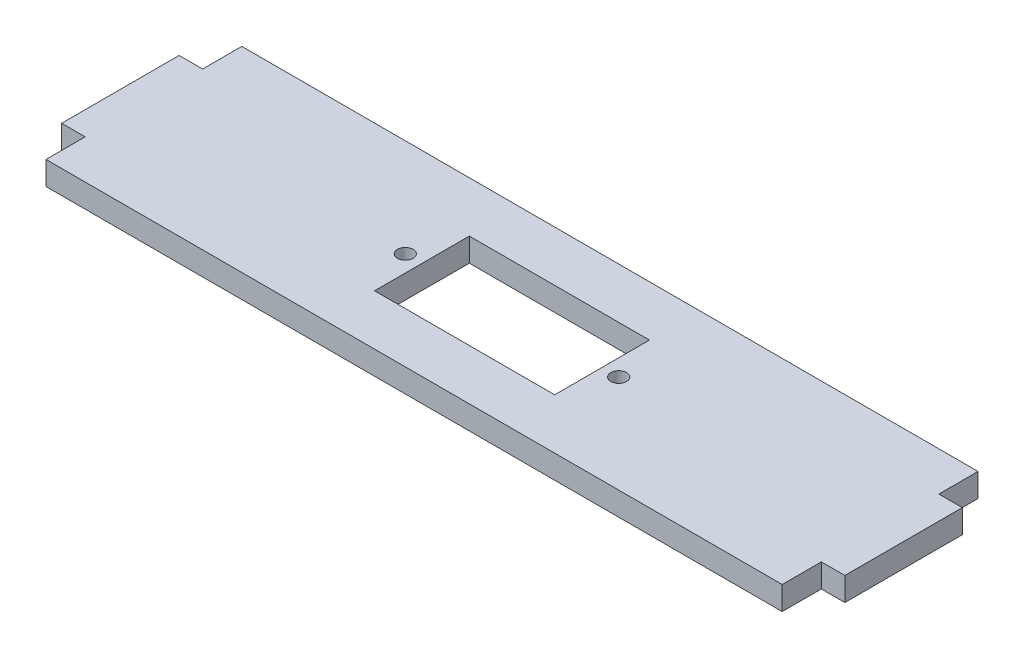
ISO-10303-21;
HEADER;
FILE_DESCRIPTION(('STEP AP214'),'2;1');
FILE_NAME('part.step','',(''),(''),'','','');
FILE_SCHEMA(('AUTOMOTIVE_DESIGN { 1 0 10303 214 1 1 1 1 }'));
ENDSEC;
DATA;
#1=APPLICATION_CONTEXT('core data for automotive mechanical design processes');
#2=APPLICATION_PROTOCOL_DEFINITION('international standard','automotive_design',2000,#1);
#3=PRODUCT_CONTEXT('',#1,'mechanical');
#4=PRODUCT('Part','Part','',(#3));
#5=PRODUCT_RELATED_PRODUCT_CATEGORY('part','',(#4));
#6=PRODUCT_DEFINITION_FORMATION('','',#4);
#7=PRODUCT_DEFINITION_CONTEXT('part definition',#1,'design');
#8=PRODUCT_DEFINITION('design','',#6,#7);
#9=PRODUCT_DEFINITION_SHAPE('','',#8);
#10=(LENGTH_UNIT() NAMED_UNIT(*) SI_UNIT(.MILLI.,.METRE.));
#11=(NAMED_UNIT(*) PLANE_ANGLE_UNIT() SI_UNIT($,.RADIAN.));
#12=(NAMED_UNIT(*) SI_UNIT($,.STERADIAN.) SOLID_ANGLE_UNIT());
#13=UNCERTAINTY_MEASURE_WITH_UNIT(LENGTH_MEASURE(1.E-05),#10,'distance_accuracy_value','');
#14=(GEOMETRIC_REPRESENTATION_CONTEXT(3) GLOBAL_UNCERTAINTY_ASSIGNED_CONTEXT((#13)) GLOBAL_UNIT_ASSIGNED_CONTEXT((#10,
#11,#12)) REPRESENTATION_CONTEXT('',''));
#15=CARTESIAN_POINT('',(0.,0.,0.));
#16=DIRECTION('',(0.,0.,1.));
#17=DIRECTION('',(1.,0.,0.));
#18=AXIS2_PLACEMENT_3D('',#15,#16,#17);
#19=CARTESIAN_POINT('',(-47.,3.,0.));
#20=DIRECTION('',(-1.,0.,0.));
#21=DIRECTION('',(0.,0.,1.));
#22=AXIS2_PLACEMENT_3D('',#19,#20,#21);
#23=PLANE('',#22);
#24=DIRECTION('',(0.,0.,-1.));
#25=VECTOR('',#24,1.);
#26=CARTESIAN_POINT('',(-47.,0.,0.));
#27=LINE('',#26,#25);
#28=CARTESIAN_POINT('',(-47.,0.,12.5));
#29=VERTEX_POINT('',#28);
#30=CARTESIAN_POINT('',(-47.,0.,7.5));
#31=VERTEX_POINT('',#30);
#32=EDGE_CURVE('E236',#29,#31,#27,.T.);
#33=ORIENTED_EDGE('',*,*,#32,.F.);
#34=DIRECTION('',(0.,-1.,0.));
#35=VECTOR('',#34,1.);
#36=CARTESIAN_POINT('',(-47.,3.,12.5));
#37=LINE('',#36,#35);
#38=CARTESIAN_POINT('',(-47.,3.,12.5));
#39=VERTEX_POINT('',#38);
#40=EDGE_CURVE('E315',#39,#29,#37,.T.);
#41=ORIENTED_EDGE('',*,*,#40,.F.);
#42=DIRECTION('',(0.,0.,-1.));
#43=VECTOR('',#42,1.);
#44=CARTESIAN_POINT('',(-47.,3.,0.));
#45=LINE('',#44,#43);
#46=CARTESIAN_POINT('',(-47.,3.,7.5));
#47=VERTEX_POINT('',#46);
#48=EDGE_CURVE('E192',#39,#47,#45,.T.);
#49=ORIENTED_EDGE('',*,*,#48,.T.);
#50=DIRECTION('',(0.,-1.,0.));
#51=VECTOR('',#50,1.);
#52=CARTESIAN_POINT('',(-47.,3.,7.5));
#53=LINE('',#52,#51);
#54=EDGE_CURVE('E235',#47,#31,#53,.T.);
#55=ORIENTED_EDGE('',*,*,#54,.T.);
#56=EDGE_LOOP('',(#33,#41,#49,#55));
#57=FACE_BOUND('',#56,.T.);
#58=ADVANCED_FACE('F41',(#57),#23,.T.);
#59=CARTESIAN_POINT('',(0.,3.,12.5));
#60=DIRECTION('',(0.,0.,-1.));
#61=DIRECTION('',(-1.,0.,0.));
#62=AXIS2_PLACEMENT_3D('',#59,#60,#61);
#63=PLANE('',#62);
#64=DIRECTION('',(1.,0.,0.));
#65=VECTOR('',#64,1.);
#66=CARTESIAN_POINT('',(0.,0.,12.5));
#67=LINE('',#66,#65);
#68=CARTESIAN_POINT('',(47.,0.,12.5));
#69=VERTEX_POINT('',#68);
#70=EDGE_CURVE('E240',#29,#69,#67,.T.);
#71=ORIENTED_EDGE('',*,*,#70,.T.);
#72=DIRECTION('',(0.,-1.,0.));
#73=VECTOR('',#72,1.);
#74=CARTESIAN_POINT('',(47.,3.,12.5));
#75=LINE('',#74,#73);
#76=CARTESIAN_POINT('',(47.,3.,12.5));
#77=VERTEX_POINT('',#76);
#78=EDGE_CURVE('E311',#77,#69,#75,.T.);
#79=ORIENTED_EDGE('',*,*,#78,.F.);
#80=DIRECTION('',(1.,0.,0.));
#81=VECTOR('',#80,1.);
#82=CARTESIAN_POINT('',(0.,3.,12.5));
#83=LINE('',#82,#81);
#84=EDGE_CURVE('E196',#39,#77,#83,.T.);
#85=ORIENTED_EDGE('',*,*,#84,.F.);
#86=ORIENTED_EDGE('',*,*,#40,.T.);
#87=EDGE_LOOP('',(#71,#79,#85,#86));
#88=FACE_BOUND('',#87,.T.);
#89=ADVANCED_FACE('F364',(#88),#63,.F.);
#90=CARTESIAN_POINT('',(47.,3.,0.));
#91=DIRECTION('',(-1.,0.,0.));
#92=DIRECTION('',(0.,0.,1.));
#93=AXIS2_PLACEMENT_3D('',#90,#91,#92);
#94=PLANE('',#93);
#95=DIRECTION('',(0.,0.,-1.));
#96=VECTOR('',#95,1.);
#97=CARTESIAN_POINT('',(47.,0.,0.));
#98=LINE('',#97,#96);
#99=CARTESIAN_POINT('',(47.,0.,7.5));
#100=VERTEX_POINT('',#99);
#101=EDGE_CURVE('E243',#69,#100,#98,.T.);
#102=ORIENTED_EDGE('',*,*,#101,.T.);
#103=DIRECTION('',(0.,-1.,0.));
#104=VECTOR('',#103,1.);
#105=CARTESIAN_POINT('',(47.,3.,7.5));
#106=LINE('',#105,#104);
#107=CARTESIAN_POINT('',(47.,3.,7.5));
#108=VERTEX_POINT('',#107);
#109=EDGE_CURVE('E308',#108,#100,#106,.T.);
#110=ORIENTED_EDGE('',*,*,#109,.F.);
#111=DIRECTION('',(0.,0.,-1.));
#112=VECTOR('',#111,1.);
#113=CARTESIAN_POINT('',(47.,3.,0.));
#114=LINE('',#113,#112);
#115=EDGE_CURVE('E200',#77,#108,#114,.T.);
#116=ORIENTED_EDGE('',*,*,#115,.F.);
#117=ORIENTED_EDGE('',*,*,#78,.T.);
#118=EDGE_LOOP('',(#102,#110,#116,#117));
#119=FACE_BOUND('',#118,.T.);
#120=ADVANCED_FACE('F369',(#119),#94,.F.);
#121=CARTESIAN_POINT('',(0.,3.,7.5));
#122=DIRECTION('',(0.,0.,1.));
#123=DIRECTION('',(1.,0.,0.));
#124=AXIS2_PLACEMENT_3D('',#121,#122,#123);
#125=PLANE('',#124);
#126=DIRECTION('',(-1.,0.,0.));
#127=VECTOR('',#126,1.);
#128=CARTESIAN_POINT('',(0.,0.,7.5));
#129=LINE('',#128,#127);
#130=CARTESIAN_POINT('',(50.,0.,7.5));
#131=VERTEX_POINT('',#130);
#132=EDGE_CURVE('E247',#131,#100,#129,.T.);
#133=ORIENTED_EDGE('',*,*,#132,.F.);
#134=DIRECTION('',(0.,-1.,0.));
#135=VECTOR('',#134,1.);
#136=CARTESIAN_POINT('',(50.,3.,7.5));
#137=LINE('',#136,#135);
#138=CARTESIAN_POINT('',(50.,3.,7.5));
#139=VERTEX_POINT('',#138);
#140=EDGE_CURVE('E305',#139,#131,#137,.T.);
#141=ORIENTED_EDGE('',*,*,#140,.F.);
#142=DIRECTION('',(-1.,0.,0.));
#143=VECTOR('',#142,1.);
#144=CARTESIAN_POINT('',(0.,3.,7.5));
#145=LINE('',#144,#143);
#146=EDGE_CURVE('E203',#139,#108,#145,.T.);
#147=ORIENTED_EDGE('',*,*,#146,.T.);
#148=ORIENTED_EDGE('',*,*,#109,.T.);
#149=EDGE_LOOP('',(#133,#141,#147,#148));
#150=FACE_BOUND('',#149,.T.);
#151=ADVANCED_FACE('F416',(#150),#125,.T.);
#152=CARTESIAN_POINT('',(50.,3.,0.));
#153=DIRECTION('',(1.,0.,0.));
#154=DIRECTION('',(0.,0.,-1.));
#155=AXIS2_PLACEMENT_3D('',#152,#153,#154);
#156=PLANE('',#155);
#157=DIRECTION('',(0.,0.,1.));
#158=VECTOR('',#157,1.);
#159=CARTESIAN_POINT('',(50.,0.,0.));
#160=LINE('',#159,#158);
#161=CARTESIAN_POINT('',(50.,0.,-7.5));
#162=VERTEX_POINT('',#161);
#163=EDGE_CURVE('E251',#162,#131,#160,.T.);
#164=ORIENTED_EDGE('',*,*,#163,.F.);
#165=DIRECTION('',(0.,-1.,0.));
#166=VECTOR('',#165,1.);
#167=CARTESIAN_POINT('',(50.,3.,-7.5));
#168=LINE('',#167,#166);
#169=CARTESIAN_POINT('',(50.,3.,-7.5));
#170=VERTEX_POINT('',#169);
#171=EDGE_CURVE('E302',#170,#162,#168,.T.);
#172=ORIENTED_EDGE('',*,*,#171,.F.);
#173=DIRECTION('',(0.,0.,1.));
#174=VECTOR('',#173,1.);
#175=CARTESIAN_POINT('',(50.,3.,0.));
#176=LINE('',#175,#174);
#177=EDGE_CURVE('E207',#170,#139,#176,.T.);
#178=ORIENTED_EDGE('',*,*,#177,.T.);
#179=ORIENTED_EDGE('',*,*,#140,.T.);
#180=EDGE_LOOP('',(#164,#172,#178,#179));
#181=FACE_BOUND('',#180,.T.);
#182=ADVANCED_FACE('F412',(#181),#156,.T.);
#183=CARTESIAN_POINT('',(0.,3.,-7.5));
#184=DIRECTION('',(0.,0.,1.));
#185=DIRECTION('',(1.,0.,0.));
#186=AXIS2_PLACEMENT_3D('',#183,#184,#185);
#187=PLANE('',#186);
#188=DIRECTION('',(-1.,0.,0.));
#189=VECTOR('',#188,1.);
#190=CARTESIAN_POINT('',(0.,0.,-7.5));
#191=LINE('',#190,#189);
#192=CARTESIAN_POINT('',(47.,0.,-7.5));
#193=VERTEX_POINT('',#192);
#194=EDGE_CURVE('E255',#162,#193,#191,.T.);
#195=ORIENTED_EDGE('',*,*,#194,.T.);
#196=DIRECTION('',(0.,-1.,0.));
#197=VECTOR('',#196,1.);
#198=CARTESIAN_POINT('',(47.,3.,-7.5));
#199=LINE('',#198,#197);
#200=CARTESIAN_POINT('',(47.,3.,-7.5));
#201=VERTEX_POINT('',#200);
#202=EDGE_CURVE('E299',#201,#193,#199,.T.);
#203=ORIENTED_EDGE('',*,*,#202,.F.);
#204=DIRECTION('',(-1.,0.,0.));
#205=VECTOR('',#204,1.);
#206=CARTESIAN_POINT('',(0.,3.,-7.5));
#207=LINE('',#206,#205);
#208=EDGE_CURVE('E211',#170,#201,#207,.T.);
#209=ORIENTED_EDGE('',*,*,#208,.F.);
#210=ORIENTED_EDGE('',*,*,#171,.T.);
#211=EDGE_LOOP('',(#195,#203,#209,#210));
#212=FACE_BOUND('',#211,.T.);
#213=ADVANCED_FACE('F423',(#212),#187,.F.);
#214=CARTESIAN_POINT('',(47.,3.,0.));
#215=DIRECTION('',(1.,0.,0.));
#216=DIRECTION('',(0.,0.,-1.));
#217=AXIS2_PLACEMENT_3D('',#214,#215,#216);
#218=PLANE('',#217);
#219=DIRECTION('',(0.,0.,1.));
#220=VECTOR('',#219,1.);
#221=CARTESIAN_POINT('',(47.,0.,0.));
#222=LINE('',#221,#220);
#223=CARTESIAN_POINT('',(47.,0.,-12.5));
#224=VERTEX_POINT('',#223);
#225=EDGE_CURVE('E259',#224,#193,#222,.T.);
#226=ORIENTED_EDGE('',*,*,#225,.F.);
#227=DIRECTION('',(0.,-1.,0.));
#228=VECTOR('',#227,1.);
#229=CARTESIAN_POINT('',(47.,3.,-12.5));
#230=LINE('',#229,#228);
#231=CARTESIAN_POINT('',(47.,3.,-12.5));
#232=VERTEX_POINT('',#231);
#233=EDGE_CURVE('E296',#232,#224,#230,.T.);
#234=ORIENTED_EDGE('',*,*,#233,.F.);
#235=DIRECTION('',(0.,0.,1.));
#236=VECTOR('',#235,1.);
#237=CARTESIAN_POINT('',(47.,3.,0.));
#238=LINE('',#237,#236);
#239=EDGE_CURVE('E214',#232,#201,#238,.T.);
#240=ORIENTED_EDGE('',*,*,#239,.T.);
#241=ORIENTED_EDGE('',*,*,#202,.T.);
#242=EDGE_LOOP('',(#226,#234,#240,#241));
#243=FACE_BOUND('',#242,.T.);
#244=ADVANCED_FACE('F406',(#243),#218,.T.);
#245=CARTESIAN_POINT('',(0.,3.,-12.5));
#246=DIRECTION('',(0.,0.,-1.));
#247=DIRECTION('',(-1.,0.,0.));
#248=AXIS2_PLACEMENT_3D('',#245,#246,#247);
#249=PLANE('',#248);
#250=DIRECTION('',(1.,0.,0.));
#251=VECTOR('',#250,1.);
#252=CARTESIAN_POINT('',(0.,0.,-12.5));
#253=LINE('',#252,#251);
#254=CARTESIAN_POINT('',(-47.,0.,-12.5));
#255=VERTEX_POINT('',#254);
#256=EDGE_CURVE('E263',#255,#224,#253,.T.);
#257=ORIENTED_EDGE('',*,*,#256,.F.);
#258=DIRECTION('',(0.,-1.,0.));
#259=VECTOR('',#258,1.);
#260=CARTESIAN_POINT('',(-47.,3.,-12.5));
#261=LINE('',#260,#259);
#262=CARTESIAN_POINT('',(-47.,3.,-12.5));
#263=VERTEX_POINT('',#262);
#264=EDGE_CURVE('E293',#263,#255,#261,.T.);
#265=ORIENTED_EDGE('',*,*,#264,.F.);
#266=DIRECTION('',(1.,0.,0.));
#267=VECTOR('',#266,1.);
#268=CARTESIAN_POINT('',(0.,3.,-12.5));
#269=LINE('',#268,#267);
#270=EDGE_CURVE('E218',#263,#232,#269,.T.);
#271=ORIENTED_EDGE('',*,*,#270,.T.);
#272=ORIENTED_EDGE('',*,*,#233,.T.);
#273=EDGE_LOOP('',(#257,#265,#271,#272));
#274=FACE_BOUND('',#273,.T.);
#275=ADVANCED_FACE('F401',(#274),#249,.T.);
#276=CARTESIAN_POINT('',(-47.,3.,0.));
#277=DIRECTION('',(1.,0.,0.));
#278=DIRECTION('',(0.,0.,-1.));
#279=AXIS2_PLACEMENT_3D('',#276,#277,#278);
#280=PLANE('',#279);
#281=DIRECTION('',(0.,0.,1.));
#282=VECTOR('',#281,1.);
#283=CARTESIAN_POINT('',(-47.,0.,0.));
#284=LINE('',#283,#282);
#285=CARTESIAN_POINT('',(-47.,0.,-7.5));
#286=VERTEX_POINT('',#285);
#287=EDGE_CURVE('E267',#255,#286,#284,.T.);
#288=ORIENTED_EDGE('',*,*,#287,.T.);
#289=DIRECTION('',(0.,-1.,0.));
#290=VECTOR('',#289,1.);
#291=CARTESIAN_POINT('',(-47.,3.,-7.5));
#292=LINE('',#291,#290);
#293=CARTESIAN_POINT('',(-47.,3.,-7.5));
#294=VERTEX_POINT('',#293);
#295=EDGE_CURVE('E290',#294,#286,#292,.T.);
#296=ORIENTED_EDGE('',*,*,#295,.F.);
#297=DIRECTION('',(0.,0.,1.));
#298=VECTOR('',#297,1.);
#299=CARTESIAN_POINT('',(-47.,3.,0.));
#300=LINE('',#299,#298);
#301=EDGE_CURVE('E222',#263,#294,#300,.T.);
#302=ORIENTED_EDGE('',*,*,#301,.F.);
#303=ORIENTED_EDGE('',*,*,#264,.T.);
#304=EDGE_LOOP('',(#288,#296,#302,#303));
#305=FACE_BOUND('',#304,.T.);
#306=ADVANCED_FACE('F398',(#305),#280,.F.);
#307=CARTESIAN_POINT('',(0.,3.,-7.5));
#308=DIRECTION('',(0.,0.,-1.));
#309=DIRECTION('',(-1.,0.,0.));
#310=AXIS2_PLACEMENT_3D('',#307,#308,#309);
#311=PLANE('',#310);
#312=DIRECTION('',(1.,0.,0.));
#313=VECTOR('',#312,1.);
#314=CARTESIAN_POINT('',(0.,0.,-7.5));
#315=LINE('',#314,#313);
#316=CARTESIAN_POINT('',(-50.,0.,-7.5));
#317=VERTEX_POINT('',#316);
#318=EDGE_CURVE('E271',#317,#286,#315,.T.);
#319=ORIENTED_EDGE('',*,*,#318,.F.);
#320=DIRECTION('',(0.,-1.,0.));
#321=VECTOR('',#320,1.);
#322=CARTESIAN_POINT('',(-50.,3.,-7.5));
#323=LINE('',#322,#321);
#324=CARTESIAN_POINT('',(-50.,3.,-7.5));
#325=VERTEX_POINT('',#324);
#326=EDGE_CURVE('E287',#325,#317,#323,.T.);
#327=ORIENTED_EDGE('',*,*,#326,.F.);
#328=DIRECTION('',(1.,0.,0.));
#329=VECTOR('',#328,1.);
#330=CARTESIAN_POINT('',(0.,3.,-7.5));
#331=LINE('',#330,#329);
#332=EDGE_CURVE('E225',#325,#294,#331,.T.);
#333=ORIENTED_EDGE('',*,*,#332,.T.);
#334=ORIENTED_EDGE('',*,*,#295,.T.);
#335=EDGE_LOOP('',(#319,#327,#333,#334));
#336=FACE_BOUND('',#335,.T.);
#337=ADVANCED_FACE('F394',(#336),#311,.T.);
#338=CARTESIAN_POINT('',(-50.,3.,0.));
#339=DIRECTION('',(1.,0.,0.));
#340=DIRECTION('',(0.,0.,-1.));
#341=AXIS2_PLACEMENT_3D('',#338,#339,#340);
#342=PLANE('',#341);
#343=DIRECTION('',(0.,0.,1.));
#344=VECTOR('',#343,1.);
#345=CARTESIAN_POINT('',(-50.,0.,0.));
#346=LINE('',#345,#344);
#347=CARTESIAN_POINT('',(-50.,0.,7.5));
#348=VERTEX_POINT('',#347);
#349=EDGE_CURVE('E275',#317,#348,#346,.T.);
#350=ORIENTED_EDGE('',*,*,#349,.T.);
#351=DIRECTION('',(0.,-1.,0.));
#352=VECTOR('',#351,1.);
#353=CARTESIAN_POINT('',(-50.,3.,7.5));
#354=LINE('',#353,#352);
#355=CARTESIAN_POINT('',(-50.,3.,7.5));
#356=VERTEX_POINT('',#355);
#357=EDGE_CURVE('E283',#356,#348,#354,.T.);
#358=ORIENTED_EDGE('',*,*,#357,.F.);
#359=DIRECTION('',(0.,0.,1.));
#360=VECTOR('',#359,1.);
#361=CARTESIAN_POINT('',(-50.,3.,0.));
#362=LINE('',#361,#360);
#363=EDGE_CURVE('E229',#325,#356,#362,.T.);
#364=ORIENTED_EDGE('',*,*,#363,.F.);
#365=ORIENTED_EDGE('',*,*,#326,.T.);
#366=EDGE_LOOP('',(#350,#358,#364,#365));
#367=FACE_BOUND('',#366,.T.);
#368=ADVANCED_FACE('F359',(#367),#342,.F.);
#369=CARTESIAN_POINT('',(0.,3.,7.5));
#370=DIRECTION('',(0.,0.,-1.));
#371=DIRECTION('',(-1.,0.,0.));
#372=AXIS2_PLACEMENT_3D('',#369,#370,#371);
#373=PLANE('',#372);
#374=DIRECTION('',(1.,0.,0.));
#375=VECTOR('',#374,1.);
#376=CARTESIAN_POINT('',(0.,0.,7.5));
#377=LINE('',#376,#375);
#378=EDGE_CURVE('E197',#348,#31,#377,.T.);
#379=ORIENTED_EDGE('',*,*,#378,.T.);
#380=ORIENTED_EDGE('',*,*,#54,.F.);
#381=DIRECTION('',(1.,0.,0.));
#382=VECTOR('',#381,1.);
#383=CARTESIAN_POINT('',(0.,3.,7.5));
#384=LINE('',#383,#382);
#385=EDGE_CURVE('E232',#356,#47,#384,.T.);
#386=ORIENTED_EDGE('',*,*,#385,.F.);
#387=ORIENTED_EDGE('',*,*,#357,.T.);
#388=EDGE_LOOP('',(#379,#380,#386,#387));
#389=FACE_BOUND('',#388,.T.);
#390=ADVANCED_FACE('F349',(#389),#373,.F.);
#391=CARTESIAN_POINT('',(0.,3.,0.));
#392=DIRECTION('',(0.,1.,0.));
#393=DIRECTION('',(0.,0.,1.));
#394=AXIS2_PLACEMENT_3D('',#391,#392,#393);
#395=PLANE('',#394);
#396=CARTESIAN_POINT('',(-13.625,3.,0.));
#397=DIRECTION('',(0.,1.,0.));
#398=DIRECTION('',(0.,0.,1.));
#399=AXIS2_PLACEMENT_3D('',#396,#397,#398);
#400=CIRCLE('',#399,1.);
#401=CARTESIAN_POINT('',(-13.625,3.,1.));
#402=VERTEX_POINT('',#401);
#403=EDGE_CURVE('E328',#402,#402,#400,.T.);
#404=ORIENTED_EDGE('',*,*,#403,.F.);
#405=EDGE_LOOP('',(#404));
#406=FACE_BOUND('',#405,.T.);
#407=CARTESIAN_POINT('',(13.625,3.,0.));
#408=DIRECTION('',(0.,1.,0.));
#409=DIRECTION('',(0.,0.,1.));
#410=AXIS2_PLACEMENT_3D('',#407,#408,#409);
#411=CIRCLE('',#410,1.00000000000001);
#412=CARTESIAN_POINT('',(13.625,3.,1.00000000000001));
#413=VERTEX_POINT('',#412);
#414=EDGE_CURVE('E187',#413,#413,#411,.T.);
#415=ORIENTED_EDGE('',*,*,#414,.F.);
#416=EDGE_LOOP('',(#415));
#417=FACE_BOUND('',#416,.T.);
#418=DIRECTION('',(0.,0.,1.));
#419=VECTOR('',#418,1.);
#420=CARTESIAN_POINT('',(-11.5,3.,6.05));
#421=LINE('',#420,#419);
#422=CARTESIAN_POINT('',(-11.5,3.,-6.05));
#423=VERTEX_POINT('',#422);
#424=CARTESIAN_POINT('',(-11.5,3.,6.05));
#425=VERTEX_POINT('',#424);
#426=EDGE_CURVE('E58',#423,#425,#421,.T.);
#427=ORIENTED_EDGE('',*,*,#426,.F.);
#428=DIRECTION('',(-1.,0.,0.));
#429=VECTOR('',#428,1.);
#430=CARTESIAN_POINT('',(-11.5,3.,-6.05));
#431=LINE('',#430,#429);
#432=CARTESIAN_POINT('',(11.5,3.,-6.05));
#433=VERTEX_POINT('',#432);
#434=EDGE_CURVE('E177',#433,#423,#431,.T.);
#435=ORIENTED_EDGE('',*,*,#434,.F.);
#436=DIRECTION('',(0.,0.,-1.));
#437=VECTOR('',#436,1.);
#438=CARTESIAN_POINT('',(11.5,3.,6.05));
#439=LINE('',#438,#437);
#440=CARTESIAN_POINT('',(11.5,3.,6.05));
#441=VERTEX_POINT('',#440);
#442=EDGE_CURVE('E159',#441,#433,#439,.T.);
#443=ORIENTED_EDGE('',*,*,#442,.F.);
#444=DIRECTION('',(1.,0.,0.));
#445=VECTOR('',#444,1.);
#446=CARTESIAN_POINT('',(-11.5,3.,6.05));
#447=LINE('',#446,#445);
#448=EDGE_CURVE('E169',#425,#441,#447,.T.);
#449=ORIENTED_EDGE('',*,*,#448,.F.);
#450=EDGE_LOOP('',(#427,#435,#443,#449));
#451=FACE_BOUND('',#450,.T.);
#452=ORIENTED_EDGE('',*,*,#48,.F.);
#453=ORIENTED_EDGE('',*,*,#84,.T.);
#454=ORIENTED_EDGE('',*,*,#115,.T.);
#455=ORIENTED_EDGE('',*,*,#146,.F.);
#456=ORIENTED_EDGE('',*,*,#177,.F.);
#457=ORIENTED_EDGE('',*,*,#208,.T.);
#458=ORIENTED_EDGE('',*,*,#239,.F.);
#459=ORIENTED_EDGE('',*,*,#270,.F.);
#460=ORIENTED_EDGE('',*,*,#301,.T.);
#461=ORIENTED_EDGE('',*,*,#332,.F.);
#462=ORIENTED_EDGE('',*,*,#363,.T.);
#463=ORIENTED_EDGE('',*,*,#385,.T.);
#464=EDGE_LOOP('',(#452,#453,#454,#455,#456,#457,#458,#459,#460,#461,#462,#463));
#465=FACE_BOUND('',#464,.T.);
#466=ADVANCED_FACE('F174',(#406,#417,#451,#465),#395,.T.);
#467=CARTESIAN_POINT('',(0.,0.,0.));
#468=DIRECTION('',(0.,1.,0.));
#469=DIRECTION('',(0.,0.,1.));
#470=AXIS2_PLACEMENT_3D('',#467,#468,#469);
#471=PLANE('',#470);
#472=CARTESIAN_POINT('',(-13.625,0.,0.));
#473=DIRECTION('',(0.,1.,0.));
#474=DIRECTION('',(0.,0.,1.));
#475=AXIS2_PLACEMENT_3D('',#472,#473,#474);
#476=CIRCLE('',#475,1.);
#477=CARTESIAN_POINT('',(-13.625,0.,1.));
#478=VERTEX_POINT('',#477);
#479=EDGE_CURVE('E44',#478,#478,#476,.T.);
#480=ORIENTED_EDGE('',*,*,#479,.T.);
#481=EDGE_LOOP('',(#480));
#482=FACE_BOUND('',#481,.T.);
#483=CARTESIAN_POINT('',(13.625,0.,0.));
#484=DIRECTION('',(0.,1.,0.));
#485=DIRECTION('',(0.,0.,1.));
#486=AXIS2_PLACEMENT_3D('',#483,#484,#485);
#487=CIRCLE('',#486,1.00000000000001);
#488=CARTESIAN_POINT('',(13.625,0.,1.00000000000001));
#489=VERTEX_POINT('',#488);
#490=EDGE_CURVE('E325',#489,#489,#487,.T.);
#491=ORIENTED_EDGE('',*,*,#490,.T.);
#492=EDGE_LOOP('',(#491));
#493=FACE_BOUND('',#492,.T.);
#494=DIRECTION('',(-1.,0.,0.));
#495=VECTOR('',#494,1.);
#496=CARTESIAN_POINT('',(0.,0.,-6.05));
#497=LINE('',#496,#495);
#498=CARTESIAN_POINT('',(11.5,0.,-6.05));
#499=VERTEX_POINT('',#498);
#500=CARTESIAN_POINT('',(-11.5,0.,-6.05));
#501=VERTEX_POINT('',#500);
#502=EDGE_CURVE('E50',#499,#501,#497,.T.);
#503=ORIENTED_EDGE('',*,*,#502,.T.);
#504=DIRECTION('',(0.,0.,1.));
#505=VECTOR('',#504,1.);
#506=CARTESIAN_POINT('',(-11.5,0.,0.));
#507=LINE('',#506,#505);
#508=CARTESIAN_POINT('',(-11.5,0.,6.05));
#509=VERTEX_POINT('',#508);
#510=EDGE_CURVE('E11',#501,#509,#507,.T.);
#511=ORIENTED_EDGE('',*,*,#510,.T.);
#512=DIRECTION('',(1.,0.,0.));
#513=VECTOR('',#512,1.);
#514=CARTESIAN_POINT('',(0.,0.,6.05));
#515=LINE('',#514,#513);
#516=CARTESIAN_POINT('',(11.5,0.,6.05));
#517=VERTEX_POINT('',#516);
#518=EDGE_CURVE('E318',#509,#517,#515,.T.);
#519=ORIENTED_EDGE('',*,*,#518,.T.);
#520=DIRECTION('',(0.,0.,-1.));
#521=VECTOR('',#520,1.);
#522=CARTESIAN_POINT('',(11.5,0.,0.));
#523=LINE('',#522,#521);
#524=EDGE_CURVE('E162',#517,#499,#523,.T.);
#525=ORIENTED_EDGE('',*,*,#524,.T.);
#526=EDGE_LOOP('',(#503,#511,#519,#525));
#527=FACE_BOUND('',#526,.T.);
#528=ORIENTED_EDGE('',*,*,#32,.T.);
#529=ORIENTED_EDGE('',*,*,#378,.F.);
#530=ORIENTED_EDGE('',*,*,#349,.F.);
#531=ORIENTED_EDGE('',*,*,#318,.T.);
#532=ORIENTED_EDGE('',*,*,#287,.F.);
#533=ORIENTED_EDGE('',*,*,#256,.T.);
#534=ORIENTED_EDGE('',*,*,#225,.T.);
#535=ORIENTED_EDGE('',*,*,#194,.F.);
#536=ORIENTED_EDGE('',*,*,#163,.T.);
#537=ORIENTED_EDGE('',*,*,#132,.T.);
#538=ORIENTED_EDGE('',*,*,#101,.F.);
#539=ORIENTED_EDGE('',*,*,#70,.F.);
#540=EDGE_LOOP('',(#528,#529,#530,#531,#532,#533,#534,#535,#536,#537,#538,#539));
#541=FACE_BOUND('',#540,.T.);
#542=ADVANCED_FACE('F348',(#482,#493,#527,#541),#471,.F.);
#543=CARTESIAN_POINT('',(-11.5,-20.3,6.05));
#544=DIRECTION('',(-1.,0.,0.));
#545=DIRECTION('',(0.,0.,1.));
#546=AXIS2_PLACEMENT_3D('',#543,#544,#545);
#547=PLANE('',#546);
#548=DIRECTION('',(0.,1.,0.));
#549=VECTOR('',#548,1.);
#550=CARTESIAN_POINT('',(-11.5,-20.3,-6.05));
#551=LINE('',#550,#549);
#552=EDGE_CURVE('E184',#501,#423,#551,.T.);
#553=ORIENTED_EDGE('',*,*,#552,.T.);
#554=ORIENTED_EDGE('',*,*,#426,.T.);
#555=DIRECTION('',(0.,1.,0.));
#556=VECTOR('',#555,1.);
#557=CARTESIAN_POINT('',(-11.5,-20.3,6.05));
#558=LINE('',#557,#556);
#559=EDGE_CURVE('E166',#509,#425,#558,.T.);
#560=ORIENTED_EDGE('',*,*,#559,.F.);
#561=ORIENTED_EDGE('',*,*,#510,.F.);
#562=EDGE_LOOP('',(#553,#554,#560,#561));
#563=FACE_BOUND('',#562,.T.);
#564=ADVANCED_FACE('F356',(#563),#547,.F.);
#565=CARTESIAN_POINT('',(-11.5,-20.3,-6.05));
#566=DIRECTION('',(0.,0.,-1.));
#567=DIRECTION('',(-1.,0.,0.));
#568=AXIS2_PLACEMENT_3D('',#565,#566,#567);
#569=PLANE('',#568);
#570=DIRECTION('',(0.,1.,0.));
#571=VECTOR('',#570,1.);
#572=CARTESIAN_POINT('',(11.5,-20.3,-6.05));
#573=LINE('',#572,#571);
#574=EDGE_CURVE('E165',#499,#433,#573,.T.);
#575=ORIENTED_EDGE('',*,*,#574,.T.);
#576=ORIENTED_EDGE('',*,*,#434,.T.);
#577=ORIENTED_EDGE('',*,*,#552,.F.);
#578=ORIENTED_EDGE('',*,*,#502,.F.);
#579=EDGE_LOOP('',(#575,#576,#577,#578));
#580=FACE_BOUND('',#579,.T.);
#581=ADVANCED_FACE('F465',(#580),#569,.F.);
#582=CARTESIAN_POINT('',(11.5,-20.3,6.05));
#583=DIRECTION('',(1.,0.,0.));
#584=DIRECTION('',(0.,0.,-1.));
#585=AXIS2_PLACEMENT_3D('',#582,#583,#584);
#586=PLANE('',#585);
#587=DIRECTION('',(0.,1.,0.));
#588=VECTOR('',#587,1.);
#589=CARTESIAN_POINT('',(11.5,-20.3,6.05));
#590=LINE('',#589,#588);
#591=EDGE_CURVE('E66',#517,#441,#590,.T.);
#592=ORIENTED_EDGE('',*,*,#591,.T.);
#593=ORIENTED_EDGE('',*,*,#442,.T.);
#594=ORIENTED_EDGE('',*,*,#574,.F.);
#595=ORIENTED_EDGE('',*,*,#524,.F.);
#596=EDGE_LOOP('',(#592,#593,#594,#595));
#597=FACE_BOUND('',#596,.T.);
#598=ADVANCED_FACE('F156',(#597),#586,.F.);
#599=CARTESIAN_POINT('',(-11.5,-20.3,6.05));
#600=DIRECTION('',(0.,0.,1.));
#601=DIRECTION('',(1.,0.,0.));
#602=AXIS2_PLACEMENT_3D('',#599,#600,#601);
#603=PLANE('',#602);
#604=ORIENTED_EDGE('',*,*,#559,.T.);
#605=ORIENTED_EDGE('',*,*,#448,.T.);
#606=ORIENTED_EDGE('',*,*,#591,.F.);
#607=ORIENTED_EDGE('',*,*,#518,.F.);
#608=EDGE_LOOP('',(#604,#605,#606,#607));
#609=FACE_BOUND('',#608,.T.);
#610=ADVANCED_FACE('F170',(#609),#603,.F.);
#611=CARTESIAN_POINT('',(13.625,-20.3,0.));
#612=DIRECTION('',(0.,1.,0.));
#613=DIRECTION('',(0.,0.,1.));
#614=AXIS2_PLACEMENT_3D('',#611,#612,#613);
#615=CYLINDRICAL_SURFACE('',#614,1.00000000000001);
#616=ORIENTED_EDGE('',*,*,#414,.T.);
#617=EDGE_LOOP('',(#616));
#618=FACE_BOUND('',#617,.T.);
#619=ORIENTED_EDGE('',*,*,#490,.F.);
#620=EDGE_LOOP('',(#619));
#621=FACE_BOUND('',#620,.T.);
#622=ADVANCED_FACE('F344',(#618,#621),#615,.F.);
#623=CARTESIAN_POINT('',(-13.625,-20.3,0.));
#624=DIRECTION('',(0.,1.,0.));
#625=DIRECTION('',(0.,0.,1.));
#626=AXIS2_PLACEMENT_3D('',#623,#624,#625);
#627=CYLINDRICAL_SURFACE('',#626,1.);
#628=ORIENTED_EDGE('',*,*,#403,.T.);
#629=EDGE_LOOP('',(#628));
#630=FACE_BOUND('',#629,.T.);
#631=ORIENTED_EDGE('',*,*,#479,.F.);
#632=EDGE_LOOP('',(#631));
#633=FACE_BOUND('',#632,.T.);
#634=ADVANCED_FACE('F498',(#630,#633),#627,.F.);
#635=CLOSED_SHELL('',(#58,#89,#120,#151,#182,#213,#244,#275,#306,#337,#368,#390,#466,#542,#564,
#581,#598,#610,#622,#634));
#636=MANIFOLD_SOLID_BREP('B2',#635);
#637=ADVANCED_BREP_SHAPE_REPRESENTATION('',(#18,#636),#14);
#638=SHAPE_DEFINITION_REPRESENTATION(#9,#637);
ENDSEC;
END-ISO-10303-21;
